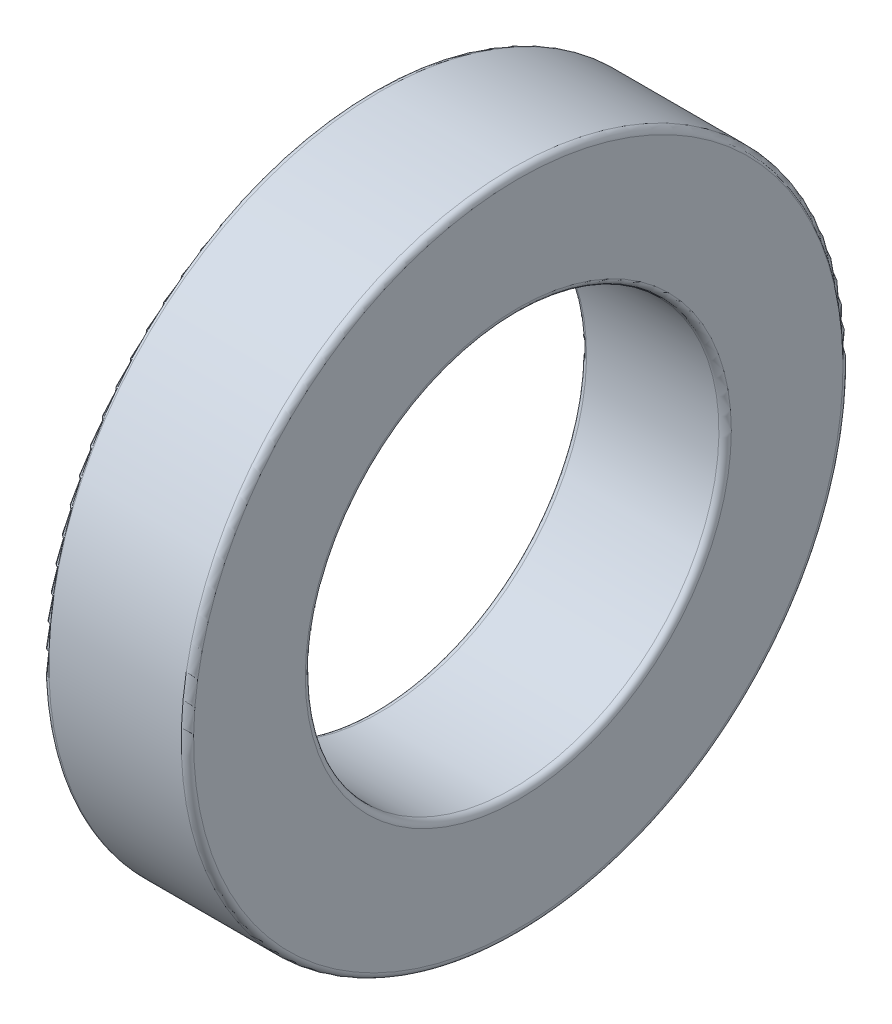
ISO-10303-21;
HEADER;
FILE_DESCRIPTION(('STEP AP214'),'2;1');
FILE_NAME('part.step','',(''),(''),'','','');
FILE_SCHEMA(('AUTOMOTIVE_DESIGN { 1 0 10303 214 1 1 1 1 }'));
ENDSEC;
DATA;
#1=APPLICATION_CONTEXT('core data for automotive mechanical design processes');
#2=APPLICATION_PROTOCOL_DEFINITION('international standard','automotive_design',2000,#1);
#3=PRODUCT_CONTEXT('',#1,'mechanical');
#4=PRODUCT('Part','Part','',(#3));
#5=PRODUCT_RELATED_PRODUCT_CATEGORY('part','',(#4));
#6=PRODUCT_DEFINITION_FORMATION('','',#4);
#7=PRODUCT_DEFINITION_CONTEXT('part definition',#1,'design');
#8=PRODUCT_DEFINITION('design','',#6,#7);
#9=PRODUCT_DEFINITION_SHAPE('','',#8);
#10=(LENGTH_UNIT() NAMED_UNIT(*) SI_UNIT(.MILLI.,.METRE.));
#11=(NAMED_UNIT(*) PLANE_ANGLE_UNIT() SI_UNIT($,.RADIAN.));
#12=(NAMED_UNIT(*) SI_UNIT($,.STERADIAN.) SOLID_ANGLE_UNIT());
#13=UNCERTAINTY_MEASURE_WITH_UNIT(LENGTH_MEASURE(1.E-05),#10,'distance_accuracy_value','');
#14=(GEOMETRIC_REPRESENTATION_CONTEXT(3) GLOBAL_UNCERTAINTY_ASSIGNED_CONTEXT((#13)) GLOBAL_UNIT_ASSIGNED_CONTEXT((#10,
#11,#12)) REPRESENTATION_CONTEXT('',''));
#15=CARTESIAN_POINT('',(0.,0.,0.));
#16=DIRECTION('',(0.,0.,1.));
#17=DIRECTION('',(1.,0.,0.));
#18=AXIS2_PLACEMENT_3D('',#15,#16,#17);
#19=CARTESIAN_POINT('',(1.75,6.5,0.));
#20=DIRECTION('',(-1.,0.,0.));
#21=DIRECTION('',(0.,-1.,0.));
#22=AXIS2_PLACEMENT_3D('',#19,#20,#21);
#23=PLANE('',#22);
#24=CARTESIAN_POINT('',(1.75,0.,0.));
#25=DIRECTION('',(1.,0.,0.));
#26=DIRECTION('',(0.,1.,0.));
#27=AXIS2_PLACEMENT_3D('',#24,#25,#26);
#28=CIRCLE('',#27,7.85);
#29=CARTESIAN_POINT('',(1.75,7.85,0.));
#30=VERTEX_POINT('',#29);
#31=EDGE_CURVE('E46',#30,#30,#28,.T.);
#32=ORIENTED_EDGE('',*,*,#31,.F.);
#33=EDGE_LOOP('',(#32));
#34=FACE_BOUND('',#33,.T.);
#35=CARTESIAN_POINT('',(1.75,0.,0.));
#36=DIRECTION('',(1.,0.,0.));
#37=DIRECTION('',(0.,1.,0.));
#38=AXIS2_PLACEMENT_3D('',#35,#36,#37);
#39=CIRCLE('',#38,5.15);
#40=CARTESIAN_POINT('',(1.75,5.15,0.));
#41=VERTEX_POINT('',#40);
#42=EDGE_CURVE('E11',#41,#41,#39,.T.);
#43=ORIENTED_EDGE('',*,*,#42,.T.);
#44=EDGE_LOOP('',(#43));
#45=FACE_BOUND('',#44,.T.);
#46=ADVANCED_FACE('F36',(#34,#45),#23,.T.);
#47=CARTESIAN_POINT('',(1.9,0.,0.));
#48=DIRECTION('',(1.,0.,0.));
#49=DIRECTION('',(0.,0.,-1.));
#50=AXIS2_PLACEMENT_3D('',#47,#48,#49);
#51=TOROIDAL_SURFACE('',#50,7.85,0.15);
#52=CARTESIAN_POINT('',(1.9,0.,0.));
#53=DIRECTION('',(1.,0.,0.));
#54=DIRECTION('',(0.,1.,0.));
#55=AXIS2_PLACEMENT_3D('',#52,#53,#54);
#56=CIRCLE('',#55,8.);
#57=CARTESIAN_POINT('',(1.9,8.,0.));
#58=VERTEX_POINT('',#57);
#59=EDGE_CURVE('E87',#58,#58,#56,.T.);
#60=ORIENTED_EDGE('',*,*,#59,.F.);
#61=EDGE_LOOP('',(#60));
#62=FACE_BOUND('',#61,.T.);
#63=ORIENTED_EDGE('',*,*,#31,.T.);
#64=EDGE_LOOP('',(#63));
#65=FACE_BOUND('',#64,.T.);
#66=ADVANCED_FACE('F158',(#62,#65),#51,.T.);
#67=CARTESIAN_POINT('',(3.5,0.,0.));
#68=DIRECTION('',(-1.,0.,0.));
#69=DIRECTION('',(0.,1.,0.));
#70=AXIS2_PLACEMENT_3D('',#67,#68,#69);
#71=CYLINDRICAL_SURFACE('',#70,8.);
#72=CARTESIAN_POINT('',(5.1,0.,0.));
#73=DIRECTION('',(1.,0.,0.));
#74=DIRECTION('',(0.,1.,0.));
#75=AXIS2_PLACEMENT_3D('',#72,#73,#74);
#76=CIRCLE('',#75,8.);
#77=CARTESIAN_POINT('',(5.1,8.,0.));
#78=VERTEX_POINT('',#77);
#79=EDGE_CURVE('E92',#78,#78,#76,.T.);
#80=ORIENTED_EDGE('',*,*,#79,.F.);
#81=EDGE_LOOP('',(#80));
#82=FACE_BOUND('',#81,.T.);
#83=ORIENTED_EDGE('',*,*,#59,.T.);
#84=EDGE_LOOP('',(#83));
#85=FACE_BOUND('',#84,.T.);
#86=ADVANCED_FACE('F160',(#82,#85),#71,.T.);
#87=CARTESIAN_POINT('',(5.1,0.,0.));
#88=DIRECTION('',(1.,0.,0.));
#89=DIRECTION('',(0.,0.,-1.));
#90=AXIS2_PLACEMENT_3D('',#87,#88,#89);
#91=TOROIDAL_SURFACE('',#90,7.85,0.15);
#92=CARTESIAN_POINT('',(5.25,0.,0.));
#93=DIRECTION('',(1.,0.,0.));
#94=DIRECTION('',(0.,1.,0.));
#95=AXIS2_PLACEMENT_3D('',#92,#93,#94);
#96=CIRCLE('',#95,7.85);
#97=CARTESIAN_POINT('',(5.25,7.85,0.));
#98=VERTEX_POINT('',#97);
#99=EDGE_CURVE('E40',#98,#98,#96,.T.);
#100=ORIENTED_EDGE('',*,*,#99,.F.);
#101=EDGE_LOOP('',(#100));
#102=FACE_BOUND('',#101,.T.);
#103=ORIENTED_EDGE('',*,*,#79,.T.);
#104=EDGE_LOOP('',(#103));
#105=FACE_BOUND('',#104,.T.);
#106=ADVANCED_FACE('F166',(#102,#105),#91,.T.);
#107=CARTESIAN_POINT('',(5.25,6.5,0.));
#108=DIRECTION('',(1.,0.,0.));
#109=DIRECTION('',(0.,1.,0.));
#110=AXIS2_PLACEMENT_3D('',#107,#108,#109);
#111=PLANE('',#110);
#112=CARTESIAN_POINT('',(5.25,0.,0.));
#113=DIRECTION('',(1.,0.,0.));
#114=DIRECTION('',(0.,1.,0.));
#115=AXIS2_PLACEMENT_3D('',#112,#113,#114);
#116=CIRCLE('',#115,5.15);
#117=CARTESIAN_POINT('',(5.25,5.15,0.));
#118=VERTEX_POINT('',#117);
#119=EDGE_CURVE('E135',#118,#118,#116,.T.);
#120=ORIENTED_EDGE('',*,*,#119,.F.);
#121=EDGE_LOOP('',(#120));
#122=FACE_BOUND('',#121,.T.);
#123=ORIENTED_EDGE('',*,*,#99,.T.);
#124=EDGE_LOOP('',(#123));
#125=FACE_BOUND('',#124,.T.);
#126=ADVANCED_FACE('F173',(#122,#125),#111,.T.);
#127=CARTESIAN_POINT('',(5.1,0.,0.));
#128=DIRECTION('',(1.,0.,0.));
#129=DIRECTION('',(0.,0.,-1.));
#130=AXIS2_PLACEMENT_3D('',#127,#128,#129);
#131=TOROIDAL_SURFACE('',#130,5.15,0.15);
#132=CARTESIAN_POINT('',(5.1,0.,0.));
#133=DIRECTION('',(1.,0.,0.));
#134=DIRECTION('',(0.,1.,0.));
#135=AXIS2_PLACEMENT_3D('',#132,#133,#134);
#136=CIRCLE('',#135,5.);
#137=CARTESIAN_POINT('',(5.1,5.,0.));
#138=VERTEX_POINT('',#137);
#139=EDGE_CURVE('E137',#138,#138,#136,.T.);
#140=ORIENTED_EDGE('',*,*,#139,.F.);
#141=EDGE_LOOP('',(#140));
#142=FACE_BOUND('',#141,.T.);
#143=ORIENTED_EDGE('',*,*,#119,.T.);
#144=EDGE_LOOP('',(#143));
#145=FACE_BOUND('',#144,.T.);
#146=ADVANCED_FACE('F193',(#142,#145),#131,.T.);
#147=CARTESIAN_POINT('',(3.5,0.,0.));
#148=DIRECTION('',(-1.,0.,0.));
#149=DIRECTION('',(0.,1.,0.));
#150=AXIS2_PLACEMENT_3D('',#147,#148,#149);
#151=CYLINDRICAL_SURFACE('',#150,5.);
#152=CARTESIAN_POINT('',(1.9,0.,0.));
#153=DIRECTION('',(1.,0.,0.));
#154=DIRECTION('',(0.,1.,0.));
#155=AXIS2_PLACEMENT_3D('',#152,#153,#154);
#156=CIRCLE('',#155,5.);
#157=CARTESIAN_POINT('',(1.9,5.,0.));
#158=VERTEX_POINT('',#157);
#159=EDGE_CURVE('E120',#158,#158,#156,.T.);
#160=ORIENTED_EDGE('',*,*,#159,.F.);
#161=EDGE_LOOP('',(#160));
#162=FACE_BOUND('',#161,.T.);
#163=ORIENTED_EDGE('',*,*,#139,.T.);
#164=EDGE_LOOP('',(#163));
#165=FACE_BOUND('',#164,.T.);
#166=ADVANCED_FACE('F178',(#162,#165),#151,.F.);
#167=CARTESIAN_POINT('',(1.9,0.,0.));
#168=DIRECTION('',(1.,0.,0.));
#169=DIRECTION('',(0.,0.,-1.));
#170=AXIS2_PLACEMENT_3D('',#167,#168,#169);
#171=TOROIDAL_SURFACE('',#170,5.15,0.15);
#172=ORIENTED_EDGE('',*,*,#42,.F.);
#173=EDGE_LOOP('',(#172));
#174=FACE_BOUND('',#173,.T.);
#175=ORIENTED_EDGE('',*,*,#159,.T.);
#176=EDGE_LOOP('',(#175));
#177=FACE_BOUND('',#176,.T.);
#178=ADVANCED_FACE('F175',(#174,#177),#171,.T.);
#179=CLOSED_SHELL('',(#46,#66,#86,#106,#126,#146,#166,#178));
#180=CARTESIAN_POINT('',(3.575,-6.5,0.));
#181=DIRECTION('',(1.,0.,0.));
#182=DIRECTION('',(0.,-1.,0.));
#183=AXIS2_PLACEMENT_3D('',#180,#181,#182);
#184=PLANE('',#183);
#185=CARTESIAN_POINT('',(3.575,0.,0.));
#186=DIRECTION('',(1.,0.,0.));
#187=DIRECTION('',(0.,-1.,0.));
#188=AXIS2_PLACEMENT_3D('',#185,#186,#187);
#189=CIRCLE('',#188,6.425);
#190=CARTESIAN_POINT('',(3.575,6.425,0.));
#191=VERTEX_POINT('',#190);
#192=EDGE_CURVE('E117',#191,#191,#189,.T.);
#193=ORIENTED_EDGE('',*,*,#192,.F.);
#194=EDGE_LOOP('',(#193));
#195=FACE_BOUND('',#194,.T.);
#196=CARTESIAN_POINT('',(3.575,0.,0.));
#197=DIRECTION('',(1.,0.,0.));
#198=DIRECTION('',(0.,-1.,0.));
#199=AXIS2_PLACEMENT_3D('',#196,#197,#198);
#200=CIRCLE('',#199,6.);
#201=CARTESIAN_POINT('',(3.575,-6.,0.));
#202=VERTEX_POINT('',#201);
#203=EDGE_CURVE('E141',#202,#202,#200,.T.);
#204=ORIENTED_EDGE('',*,*,#203,.T.);
#205=EDGE_LOOP('',(#204));
#206=FACE_BOUND('',#205,.T.);
#207=ADVANCED_FACE('F180',(#195,#206),#184,.F.);
#208=CARTESIAN_POINT('',(3.425,-6.5,0.));
#209=DIRECTION('',(-1.,0.,0.));
#210=DIRECTION('',(0.,1.,0.));
#211=AXIS2_PLACEMENT_3D('',#208,#209,#210);
#212=PLANE('',#211);
#213=CARTESIAN_POINT('',(3.425,0.,0.));
#214=DIRECTION('',(-1.,0.,0.));
#215=DIRECTION('',(0.,-1.,0.));
#216=AXIS2_PLACEMENT_3D('',#213,#214,#215);
#217=CIRCLE('',#216,6.425);
#218=CARTESIAN_POINT('',(3.425,6.425,0.));
#219=VERTEX_POINT('',#218);
#220=EDGE_CURVE('E128',#219,#219,#217,.T.);
#221=ORIENTED_EDGE('',*,*,#220,.F.);
#222=EDGE_LOOP('',(#221));
#223=FACE_BOUND('',#222,.T.);
#224=CARTESIAN_POINT('',(3.425,0.,0.));
#225=DIRECTION('',(1.,0.,0.));
#226=DIRECTION('',(0.,-1.,0.));
#227=AXIS2_PLACEMENT_3D('',#224,#225,#226);
#228=CIRCLE('',#227,6.);
#229=CARTESIAN_POINT('',(3.425,-6.,0.));
#230=VERTEX_POINT('',#229);
#231=EDGE_CURVE('E129',#230,#230,#228,.T.);
#232=ORIENTED_EDGE('',*,*,#231,.F.);
#233=EDGE_LOOP('',(#232));
#234=FACE_BOUND('',#233,.T.);
#235=ADVANCED_FACE('F182',(#223,#234),#212,.F.);
#236=CARTESIAN_POINT('',(3.5,0.,0.));
#237=DIRECTION('',(-1.,0.,0.));
#238=DIRECTION('',(0.,-1.,0.));
#239=AXIS2_PLACEMENT_3D('',#236,#237,#238);
#240=CYLINDRICAL_SURFACE('',#239,7.);
#241=CARTESIAN_POINT('',(3.575,0.,0.));
#242=DIRECTION('',(1.,0.,0.));
#243=DIRECTION('',(0.,-1.,0.));
#244=AXIS2_PLACEMENT_3D('',#241,#242,#243);
#245=CIRCLE('',#244,7.);
#246=CARTESIAN_POINT('',(3.575,-7.,0.));
#247=VERTEX_POINT('',#246);
#248=EDGE_CURVE('E132',#247,#247,#245,.T.);
#249=ORIENTED_EDGE('',*,*,#248,.T.);
#250=EDGE_LOOP('',(#249));
#251=FACE_BOUND('',#250,.T.);
#252=CARTESIAN_POINT('',(3.425,0.,0.));
#253=DIRECTION('',(1.,0.,0.));
#254=DIRECTION('',(0.,-1.,0.));
#255=AXIS2_PLACEMENT_3D('',#252,#253,#254);
#256=CIRCLE('',#255,7.);
#257=CARTESIAN_POINT('',(3.425,-7.,0.));
#258=VERTEX_POINT('',#257);
#259=EDGE_CURVE('E133',#258,#258,#256,.T.);
#260=ORIENTED_EDGE('',*,*,#259,.F.);
#261=EDGE_LOOP('',(#260));
#262=FACE_BOUND('',#261,.T.);
#263=ADVANCED_FACE('F38',(#251,#262),#240,.F.);
#264=CARTESIAN_POINT('',(3.575,-6.5,0.));
#265=DIRECTION('',(1.,0.,0.));
#266=DIRECTION('',(0.,-1.,0.));
#267=AXIS2_PLACEMENT_3D('',#264,#265,#266);
#268=PLANE('',#267);
#269=CARTESIAN_POINT('',(3.575,0.,0.));
#270=DIRECTION('',(-1.,0.,0.));
#271=DIRECTION('',(0.,-1.,0.));
#272=AXIS2_PLACEMENT_3D('',#269,#270,#271);
#273=CIRCLE('',#272,6.575);
#274=CARTESIAN_POINT('',(3.575,6.575,0.));
#275=VERTEX_POINT('',#274);
#276=EDGE_CURVE('E110',#275,#275,#273,.T.);
#277=ORIENTED_EDGE('',*,*,#276,.F.);
#278=EDGE_LOOP('',(#277));
#279=FACE_BOUND('',#278,.T.);
#280=ORIENTED_EDGE('',*,*,#248,.F.);
#281=EDGE_LOOP('',(#280));
#282=FACE_BOUND('',#281,.T.);
#283=ADVANCED_FACE('F209',(#279,#282),#268,.F.);
#284=CARTESIAN_POINT('',(3.5,0.,0.));
#285=DIRECTION('',(-1.,0.,0.));
#286=DIRECTION('',(0.,-1.,0.));
#287=AXIS2_PLACEMENT_3D('',#284,#285,#286);
#288=CYLINDRICAL_SURFACE('',#287,6.);
#289=ORIENTED_EDGE('',*,*,#231,.T.);
#290=EDGE_LOOP('',(#289));
#291=FACE_BOUND('',#290,.T.);
#292=ORIENTED_EDGE('',*,*,#203,.F.);
#293=EDGE_LOOP('',(#292));
#294=FACE_BOUND('',#293,.T.);
#295=ADVANCED_FACE('F207',(#291,#294),#288,.T.);
#296=CARTESIAN_POINT('',(3.425,-6.5,0.));
#297=DIRECTION('',(-1.,0.,0.));
#298=DIRECTION('',(0.,1.,0.));
#299=AXIS2_PLACEMENT_3D('',#296,#297,#298);
#300=PLANE('',#299);
#301=CARTESIAN_POINT('',(3.425,0.,0.));
#302=DIRECTION('',(1.,0.,0.));
#303=DIRECTION('',(0.,-1.,0.));
#304=AXIS2_PLACEMENT_3D('',#301,#302,#303);
#305=CIRCLE('',#304,6.575);
#306=CARTESIAN_POINT('',(3.425,6.575,0.));
#307=VERTEX_POINT('',#306);
#308=EDGE_CURVE('E139',#307,#307,#305,.T.);
#309=ORIENTED_EDGE('',*,*,#308,.F.);
#310=EDGE_LOOP('',(#309));
#311=FACE_BOUND('',#310,.T.);
#312=ORIENTED_EDGE('',*,*,#259,.T.);
#313=EDGE_LOOP('',(#312));
#314=FACE_BOUND('',#313,.T.);
#315=ADVANCED_FACE('F203',(#311,#314),#300,.F.);
#316=CARTESIAN_POINT('',(3.5,0.,0.));
#317=DIRECTION('',(-1.,0.,0.));
#318=DIRECTION('',(0.,-1.,0.));
#319=AXIS2_PLACEMENT_3D('',#316,#317,#318);
#320=CYLINDRICAL_SURFACE('',#319,6.575);
#321=ORIENTED_EDGE('',*,*,#308,.T.);
#322=EDGE_LOOP('',(#321));
#323=FACE_BOUND('',#322,.T.);
#324=CARTESIAN_POINT('',(2.40625,0.,0.));
#325=DIRECTION('',(1.,0.,0.));
#326=DIRECTION('',(0.,-1.,0.));
#327=AXIS2_PLACEMENT_3D('',#324,#325,#326);
#328=CIRCLE('',#327,6.575);
#329=CARTESIAN_POINT('',(2.40625,-6.575,0.));
#330=VERTEX_POINT('',#329);
#331=EDGE_CURVE('E123',#330,#330,#328,.T.);
#332=ORIENTED_EDGE('',*,*,#331,.F.);
#333=EDGE_LOOP('',(#332));
#334=FACE_BOUND('',#333,.T.);
#335=ADVANCED_FACE('F206',(#323,#334),#320,.F.);
#336=CARTESIAN_POINT('',(3.5,0.,0.));
#337=DIRECTION('',(-1.,0.,0.));
#338=DIRECTION('',(0.,-1.,0.));
#339=AXIS2_PLACEMENT_3D('',#336,#337,#338);
#340=CYLINDRICAL_SURFACE('',#339,6.425);
#341=ORIENTED_EDGE('',*,*,#220,.T.);
#342=EDGE_LOOP('',(#341));
#343=FACE_BOUND('',#342,.T.);
#344=CARTESIAN_POINT('',(2.40625,0.,0.));
#345=DIRECTION('',(1.,0.,0.));
#346=DIRECTION('',(0.,-1.,0.));
#347=AXIS2_PLACEMENT_3D('',#344,#345,#346);
#348=CIRCLE('',#347,6.425);
#349=CARTESIAN_POINT('',(2.40625,-6.425,0.));
#350=VERTEX_POINT('',#349);
#351=EDGE_CURVE('E114',#350,#350,#348,.T.);
#352=ORIENTED_EDGE('',*,*,#351,.T.);
#353=EDGE_LOOP('',(#352));
#354=FACE_BOUND('',#353,.T.);
#355=ADVANCED_FACE('F189',(#343,#354),#340,.T.);
#356=CARTESIAN_POINT('',(3.5,0.,0.));
#357=DIRECTION('',(-1.,0.,0.));
#358=DIRECTION('',(0.,-1.,0.));
#359=AXIS2_PLACEMENT_3D('',#356,#357,#358);
#360=CYLINDRICAL_SURFACE('',#359,6.575);
#361=ORIENTED_EDGE('',*,*,#276,.T.);
#362=EDGE_LOOP('',(#361));
#363=FACE_BOUND('',#362,.T.);
#364=CARTESIAN_POINT('',(4.59375,0.,0.));
#365=DIRECTION('',(1.,0.,0.));
#366=DIRECTION('',(0.,-1.,0.));
#367=AXIS2_PLACEMENT_3D('',#364,#365,#366);
#368=CIRCLE('',#367,6.575);
#369=CARTESIAN_POINT('',(4.59375,-6.575,0.));
#370=VERTEX_POINT('',#369);
#371=EDGE_CURVE('E107',#370,#370,#368,.T.);
#372=ORIENTED_EDGE('',*,*,#371,.T.);
#373=EDGE_LOOP('',(#372));
#374=FACE_BOUND('',#373,.T.);
#375=ADVANCED_FACE('F186',(#363,#374),#360,.F.);
#376=CARTESIAN_POINT('',(4.59375,-6.5,0.));
#377=DIRECTION('',(1.,0.,0.));
#378=DIRECTION('',(0.,-1.,0.));
#379=AXIS2_PLACEMENT_3D('',#376,#377,#378);
#380=PLANE('',#379);
#381=CARTESIAN_POINT('',(4.59375,0.,0.));
#382=DIRECTION('',(1.,0.,0.));
#383=DIRECTION('',(0.,-1.,0.));
#384=AXIS2_PLACEMENT_3D('',#381,#382,#383);
#385=CIRCLE('',#384,6.425);
#386=CARTESIAN_POINT('',(4.59375,-6.425,0.));
#387=VERTEX_POINT('',#386);
#388=EDGE_CURVE('E111',#387,#387,#385,.T.);
#389=ORIENTED_EDGE('',*,*,#388,.T.);
#390=EDGE_LOOP('',(#389));
#391=FACE_BOUND('',#390,.T.);
#392=ORIENTED_EDGE('',*,*,#371,.F.);
#393=EDGE_LOOP('',(#392));
#394=FACE_BOUND('',#393,.T.);
#395=ADVANCED_FACE('F108',(#391,#394),#380,.F.);
#396=CARTESIAN_POINT('',(3.5,0.,0.));
#397=DIRECTION('',(-1.,0.,0.));
#398=DIRECTION('',(0.,-1.,0.));
#399=AXIS2_PLACEMENT_3D('',#396,#397,#398);
#400=CYLINDRICAL_SURFACE('',#399,6.425);
#401=ORIENTED_EDGE('',*,*,#192,.T.);
#402=EDGE_LOOP('',(#401));
#403=FACE_BOUND('',#402,.T.);
#404=ORIENTED_EDGE('',*,*,#388,.F.);
#405=EDGE_LOOP('',(#404));
#406=FACE_BOUND('',#405,.T.);
#407=ADVANCED_FACE('F198',(#403,#406),#400,.T.);
#408=CARTESIAN_POINT('',(2.40625,-6.5,0.));
#409=DIRECTION('',(-1.,0.,0.));
#410=DIRECTION('',(0.,1.,0.));
#411=AXIS2_PLACEMENT_3D('',#408,#409,#410);
#412=PLANE('',#411);
#413=ORIENTED_EDGE('',*,*,#331,.T.);
#414=EDGE_LOOP('',(#413));
#415=FACE_BOUND('',#414,.T.);
#416=ORIENTED_EDGE('',*,*,#351,.F.);
#417=EDGE_LOOP('',(#416));
#418=FACE_BOUND('',#417,.T.);
#419=ADVANCED_FACE('F195',(#415,#418),#412,.F.);
#420=CLOSED_SHELL('',(#207,#235,#263,#283,#295,#315,#335,#355,#375,#395,#407,#419));
#421=ORIENTED_CLOSED_SHELL('',*,#179,.T.);
#422=BREP_WITH_VOIDS('B2',#420,(#421));
#423=ADVANCED_BREP_SHAPE_REPRESENTATION('',(#18,#422),#14);
#424=SHAPE_DEFINITION_REPRESENTATION(#9,#423);
ENDSEC;
END-ISO-10303-21;
